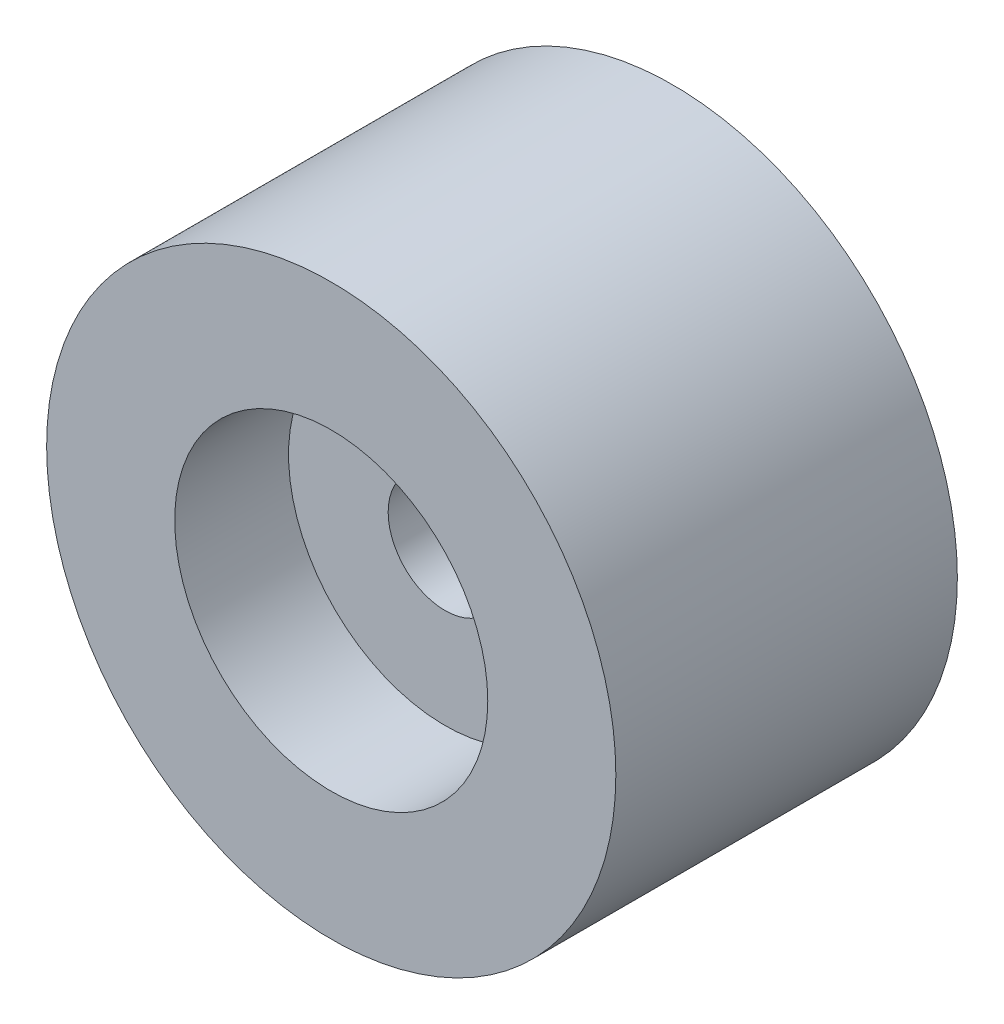
ISO-10303-21;
HEADER;
FILE_DESCRIPTION(('STEP AP214'),'2;1');
FILE_NAME('part.step','',(''),(''),'','','');
FILE_SCHEMA(('AUTOMOTIVE_DESIGN { 1 0 10303 214 1 1 1 1 }'));
ENDSEC;
DATA;
#1=APPLICATION_CONTEXT('core data for automotive mechanical design processes');
#2=APPLICATION_PROTOCOL_DEFINITION('international standard','automotive_design',2000,#1);
#3=PRODUCT_CONTEXT('',#1,'mechanical');
#4=PRODUCT('Part','Part','',(#3));
#5=PRODUCT_RELATED_PRODUCT_CATEGORY('part','',(#4));
#6=PRODUCT_DEFINITION_FORMATION('','',#4);
#7=PRODUCT_DEFINITION_CONTEXT('part definition',#1,'design');
#8=PRODUCT_DEFINITION('design','',#6,#7);
#9=PRODUCT_DEFINITION_SHAPE('','',#8);
#10=(LENGTH_UNIT() NAMED_UNIT(*) SI_UNIT(.MILLI.,.METRE.));
#11=(NAMED_UNIT(*) PLANE_ANGLE_UNIT() SI_UNIT($,.RADIAN.));
#12=(NAMED_UNIT(*) SI_UNIT($,.STERADIAN.) SOLID_ANGLE_UNIT());
#13=UNCERTAINTY_MEASURE_WITH_UNIT(LENGTH_MEASURE(1.E-05),#10,'distance_accuracy_value','');
#14=(GEOMETRIC_REPRESENTATION_CONTEXT(3) GLOBAL_UNCERTAINTY_ASSIGNED_CONTEXT((#13)) GLOBAL_UNIT_ASSIGNED_CONTEXT((#10,
#11,#12)) REPRESENTATION_CONTEXT('',''));
#15=CARTESIAN_POINT('',(0.,0.,0.));
#16=DIRECTION('',(0.,0.,1.));
#17=DIRECTION('',(1.,0.,0.));
#18=AXIS2_PLACEMENT_3D('',#15,#16,#17);
#19=CARTESIAN_POINT('',(0.,0.,24.));
#20=DIRECTION('',(0.,0.,-1.));
#21=DIRECTION('',(-1.,0.,0.));
#22=AXIS2_PLACEMENT_3D('',#19,#20,#21);
#23=CYLINDRICAL_SURFACE('',#22,4.);
#24=CARTESIAN_POINT('',(0.,0.,16.));
#25=DIRECTION('',(0.,0.,1.));
#26=DIRECTION('',(1.,0.,0.));
#27=AXIS2_PLACEMENT_3D('',#24,#25,#26);
#28=CIRCLE('',#27,4.);
#29=CARTESIAN_POINT('',(4.,0.,16.));
#30=VERTEX_POINT('',#29);
#31=EDGE_CURVE('E42',#30,#30,#28,.T.);
#32=ORIENTED_EDGE('',*,*,#31,.T.);
#33=EDGE_LOOP('',(#32));
#34=FACE_BOUND('',#33,.T.);
#35=CARTESIAN_POINT('',(0.,0.,8.));
#36=DIRECTION('',(0.,0.,-1.));
#37=DIRECTION('',(-1.,0.,0.));
#38=AXIS2_PLACEMENT_3D('',#35,#36,#37);
#39=CIRCLE('',#38,4.);
#40=CARTESIAN_POINT('',(-4.,0.,8.));
#41=VERTEX_POINT('',#40);
#42=EDGE_CURVE('E33',#41,#41,#39,.T.);
#43=ORIENTED_EDGE('',*,*,#42,.T.);
#44=EDGE_LOOP('',(#43));
#45=FACE_BOUND('',#44,.T.);
#46=ADVANCED_FACE('F29',(#34,#45),#23,.F.);
#47=CARTESIAN_POINT('',(0.,0.,24.));
#48=DIRECTION('',(0.,0.,1.));
#49=DIRECTION('',(1.,0.,0.));
#50=AXIS2_PLACEMENT_3D('',#47,#48,#49);
#51=PLANE('',#50);
#52=CARTESIAN_POINT('',(0.,0.,24.));
#53=DIRECTION('',(0.,0.,1.));
#54=DIRECTION('',(1.,0.,0.));
#55=AXIS2_PLACEMENT_3D('',#52,#53,#54);
#56=CIRCLE('',#55,11.);
#57=CARTESIAN_POINT('',(11.,0.,24.));
#58=VERTEX_POINT('',#57);
#59=EDGE_CURVE('E45',#58,#58,#56,.T.);
#60=ORIENTED_EDGE('',*,*,#59,.F.);
#61=EDGE_LOOP('',(#60));
#62=FACE_BOUND('',#61,.T.);
#63=CARTESIAN_POINT('',(0.,0.,24.));
#64=DIRECTION('',(0.,0.,1.));
#65=DIRECTION('',(1.,0.,0.));
#66=AXIS2_PLACEMENT_3D('',#63,#64,#65);
#67=CIRCLE('',#66,20.);
#68=CARTESIAN_POINT('',(20.,0.,24.));
#69=VERTEX_POINT('',#68);
#70=EDGE_CURVE('E10',#69,#69,#67,.T.);
#71=ORIENTED_EDGE('',*,*,#70,.T.);
#72=EDGE_LOOP('',(#71));
#73=FACE_BOUND('',#72,.T.);
#74=ADVANCED_FACE('F78',(#62,#73),#51,.T.);
#75=CARTESIAN_POINT('',(0.,0.,0.));
#76=DIRECTION('',(0.,0.,1.));
#77=DIRECTION('',(1.,0.,0.));
#78=AXIS2_PLACEMENT_3D('',#75,#76,#77);
#79=PLANE('',#78);
#80=CARTESIAN_POINT('',(0.,0.,0.));
#81=DIRECTION('',(0.,0.,-1.));
#82=DIRECTION('',(-1.,0.,0.));
#83=AXIS2_PLACEMENT_3D('',#80,#81,#82);
#84=CIRCLE('',#83,11.);
#85=CARTESIAN_POINT('',(-11.,0.,0.));
#86=VERTEX_POINT('',#85);
#87=EDGE_CURVE('E56',#86,#86,#84,.T.);
#88=ORIENTED_EDGE('',*,*,#87,.F.);
#89=EDGE_LOOP('',(#88));
#90=FACE_BOUND('',#89,.T.);
#91=CARTESIAN_POINT('',(0.,0.,0.));
#92=DIRECTION('',(0.,0.,1.));
#93=DIRECTION('',(1.,0.,0.));
#94=AXIS2_PLACEMENT_3D('',#91,#92,#93);
#95=CIRCLE('',#94,20.);
#96=CARTESIAN_POINT('',(20.,0.,0.));
#97=VERTEX_POINT('',#96);
#98=EDGE_CURVE('E37',#97,#97,#95,.T.);
#99=ORIENTED_EDGE('',*,*,#98,.F.);
#100=EDGE_LOOP('',(#99));
#101=FACE_BOUND('',#100,.T.);
#102=ADVANCED_FACE('F83',(#90,#101),#79,.F.);
#103=CARTESIAN_POINT('',(0.,0.,24.));
#104=DIRECTION('',(0.,0.,-1.));
#105=DIRECTION('',(-1.,0.,0.));
#106=AXIS2_PLACEMENT_3D('',#103,#104,#105);
#107=CYLINDRICAL_SURFACE('',#106,20.);
#108=ORIENTED_EDGE('',*,*,#70,.F.);
#109=EDGE_LOOP('',(#108));
#110=FACE_BOUND('',#109,.T.);
#111=ORIENTED_EDGE('',*,*,#98,.T.);
#112=EDGE_LOOP('',(#111));
#113=FACE_BOUND('',#112,.T.);
#114=ADVANCED_FACE('F31',(#110,#113),#107,.T.);
#115=CARTESIAN_POINT('',(0.,0.,16.));
#116=DIRECTION('',(0.,0.,1.));
#117=DIRECTION('',(1.,0.,0.));
#118=AXIS2_PLACEMENT_3D('',#115,#116,#117);
#119=CYLINDRICAL_SURFACE('',#118,11.);
#120=CARTESIAN_POINT('',(0.,0.,16.));
#121=DIRECTION('',(0.,0.,1.));
#122=DIRECTION('',(1.,0.,0.));
#123=AXIS2_PLACEMENT_3D('',#120,#121,#122);
#124=CIRCLE('',#123,11.);
#125=CARTESIAN_POINT('',(11.,0.,16.));
#126=VERTEX_POINT('',#125);
#127=EDGE_CURVE('E48',#126,#126,#124,.T.);
#128=ORIENTED_EDGE('',*,*,#127,.F.);
#129=EDGE_LOOP('',(#128));
#130=FACE_BOUND('',#129,.T.);
#131=ORIENTED_EDGE('',*,*,#59,.T.);
#132=EDGE_LOOP('',(#131));
#133=FACE_BOUND('',#132,.T.);
#134=ADVANCED_FACE('F87',(#130,#133),#119,.F.);
#135=CARTESIAN_POINT('',(0.,0.,16.));
#136=DIRECTION('',(0.,0.,1.));
#137=DIRECTION('',(1.,0.,0.));
#138=AXIS2_PLACEMENT_3D('',#135,#136,#137);
#139=PLANE('',#138);
#140=ORIENTED_EDGE('',*,*,#31,.F.);
#141=EDGE_LOOP('',(#140));
#142=FACE_BOUND('',#141,.T.);
#143=ORIENTED_EDGE('',*,*,#127,.T.);
#144=EDGE_LOOP('',(#143));
#145=FACE_BOUND('',#144,.T.);
#146=ADVANCED_FACE('F74',(#142,#145),#139,.T.);
#147=CARTESIAN_POINT('',(0.,0.,8.));
#148=DIRECTION('',(0.,0.,-1.));
#149=DIRECTION('',(-1.,0.,0.));
#150=AXIS2_PLACEMENT_3D('',#147,#148,#149);
#151=CYLINDRICAL_SURFACE('',#150,11.);
#152=CARTESIAN_POINT('',(0.,0.,8.));
#153=DIRECTION('',(0.,0.,-1.));
#154=DIRECTION('',(-1.,0.,0.));
#155=AXIS2_PLACEMENT_3D('',#152,#153,#154);
#156=CIRCLE('',#155,11.);
#157=CARTESIAN_POINT('',(-11.,0.,8.));
#158=VERTEX_POINT('',#157);
#159=EDGE_CURVE('E59',#158,#158,#156,.T.);
#160=ORIENTED_EDGE('',*,*,#159,.F.);
#161=EDGE_LOOP('',(#160));
#162=FACE_BOUND('',#161,.T.);
#163=ORIENTED_EDGE('',*,*,#87,.T.);
#164=EDGE_LOOP('',(#163));
#165=FACE_BOUND('',#164,.T.);
#166=ADVANCED_FACE('F69',(#162,#165),#151,.F.);
#167=CARTESIAN_POINT('',(0.,0.,8.));
#168=DIRECTION('',(0.,0.,-1.));
#169=DIRECTION('',(-1.,0.,0.));
#170=AXIS2_PLACEMENT_3D('',#167,#168,#169);
#171=PLANE('',#170);
#172=ORIENTED_EDGE('',*,*,#42,.F.);
#173=EDGE_LOOP('',(#172));
#174=FACE_BOUND('',#173,.T.);
#175=ORIENTED_EDGE('',*,*,#159,.T.);
#176=EDGE_LOOP('',(#175));
#177=FACE_BOUND('',#176,.T.);
#178=ADVANCED_FACE('F67',(#174,#177),#171,.T.);
#179=CLOSED_SHELL('',(#46,#74,#102,#114,#134,#146,#166,#178));
#180=MANIFOLD_SOLID_BREP('B2',#179);
#181=ADVANCED_BREP_SHAPE_REPRESENTATION('',(#18,#180),#14);
#182=SHAPE_DEFINITION_REPRESENTATION(#9,#181);
ENDSEC;
END-ISO-10303-21;
